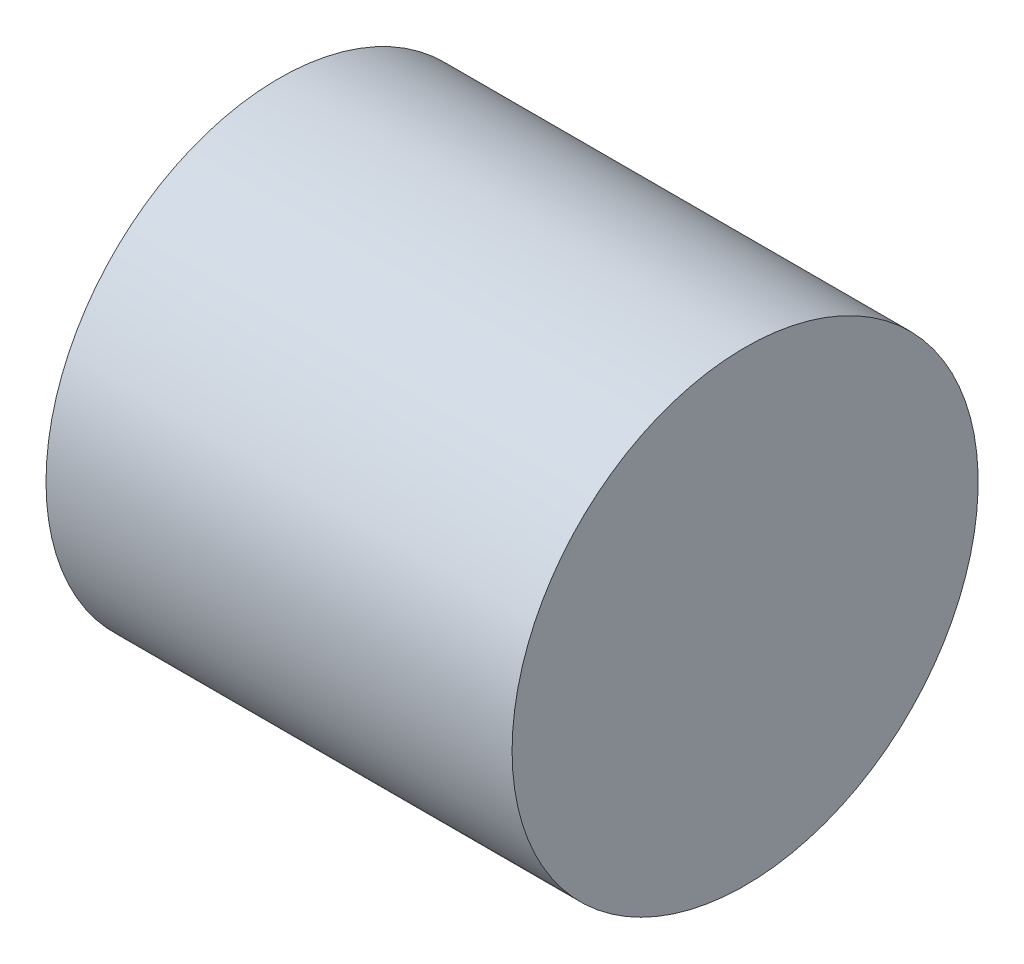
ISO-10303-21;
HEADER;
FILE_DESCRIPTION(('STEP AP214'),'2;1');
FILE_NAME('part.step','',(''),(''),'','','');
FILE_SCHEMA(('AUTOMOTIVE_DESIGN { 1 0 10303 214 1 1 1 1 }'));
ENDSEC;
DATA;
#1=APPLICATION_CONTEXT('core data for automotive mechanical design processes');
#2=APPLICATION_PROTOCOL_DEFINITION('international standard','automotive_design',2000,#1);
#3=PRODUCT_CONTEXT('',#1,'mechanical');
#4=PRODUCT('Part','Part','',(#3));
#5=PRODUCT_RELATED_PRODUCT_CATEGORY('part','',(#4));
#6=PRODUCT_DEFINITION_FORMATION('','',#4);
#7=PRODUCT_DEFINITION_CONTEXT('part definition',#1,'design');
#8=PRODUCT_DEFINITION('design','',#6,#7);
#9=PRODUCT_DEFINITION_SHAPE('','',#8);
#10=(LENGTH_UNIT() NAMED_UNIT(*) SI_UNIT(.MILLI.,.METRE.));
#11=(NAMED_UNIT(*) PLANE_ANGLE_UNIT() SI_UNIT($,.RADIAN.));
#12=(NAMED_UNIT(*) SI_UNIT($,.STERADIAN.) SOLID_ANGLE_UNIT());
#13=UNCERTAINTY_MEASURE_WITH_UNIT(LENGTH_MEASURE(1.E-05),#10,'distance_accuracy_value','');
#14=(GEOMETRIC_REPRESENTATION_CONTEXT(3) GLOBAL_UNCERTAINTY_ASSIGNED_CONTEXT((#13)) GLOBAL_UNIT_ASSIGNED_CONTEXT((#10,
#11,#12)) REPRESENTATION_CONTEXT('',''));
#15=CARTESIAN_POINT('',(0.,0.,0.));
#16=DIRECTION('',(0.,0.,1.));
#17=DIRECTION('',(1.,0.,0.));
#18=AXIS2_PLACEMENT_3D('',#15,#16,#17);
#19=CARTESIAN_POINT('',(0.,0.,0.));
#20=DIRECTION('',(1.,0.,0.));
#21=DIRECTION('',(0.,0.,-1.));
#22=AXIS2_PLACEMENT_3D('',#19,#20,#21);
#23=PLANE('',#22);
#24=CARTESIAN_POINT('',(0.,0.,0.));
#25=DIRECTION('',(-1.,0.,0.));
#26=DIRECTION('',(0.,0.,1.));
#27=AXIS2_PLACEMENT_3D('',#24,#25,#26);
#28=CIRCLE('',#27,292.1);
#29=CARTESIAN_POINT('',(0.,0.,292.1));
#30=VERTEX_POINT('',#29);
#31=EDGE_CURVE('E10',#30,#30,#28,.T.);
#32=ORIENTED_EDGE('',*,*,#31,.T.);
#33=EDGE_LOOP('',(#32));
#34=FACE_BOUND('',#33,.T.);
#35=ADVANCED_FACE('F43',(#34),#23,.F.);
#36=CARTESIAN_POINT('',(0.,0.,0.));
#37=DIRECTION('',(-1.,0.,0.));
#38=DIRECTION('',(0.,0.,1.));
#39=AXIS2_PLACEMENT_3D('',#36,#37,#38);
#40=CYLINDRICAL_SURFACE('',#39,292.1);
#41=ORIENTED_EDGE('',*,*,#31,.F.);
#42=EDGE_LOOP('',(#41));
#43=FACE_BOUND('',#42,.T.);
#44=CARTESIAN_POINT('',(584.2,0.,0.));
#45=DIRECTION('',(-1.,0.,0.));
#46=DIRECTION('',(0.,0.,1.));
#47=AXIS2_PLACEMENT_3D('',#44,#45,#46);
#48=CIRCLE('',#47,292.1);
#49=CARTESIAN_POINT('',(584.2,0.,292.1));
#50=VERTEX_POINT('',#49);
#51=EDGE_CURVE('E50',#50,#50,#48,.T.);
#52=ORIENTED_EDGE('',*,*,#51,.T.);
#53=EDGE_LOOP('',(#52));
#54=FACE_BOUND('',#53,.T.);
#55=ADVANCED_FACE('F57',(#43,#54),#40,.T.);
#56=CARTESIAN_POINT('',(584.2,292.1,0.));
#57=DIRECTION('',(-1.,0.,0.));
#58=DIRECTION('',(0.,0.,1.));
#59=AXIS2_PLACEMENT_3D('',#56,#57,#58);
#60=PLANE('',#59);
#61=ORIENTED_EDGE('',*,*,#51,.F.);
#62=EDGE_LOOP('',(#61));
#63=FACE_BOUND('',#62,.T.);
#64=ADVANCED_FACE('F59',(#63),#60,.F.);
#65=CLOSED_SHELL('',(#35,#55,#64));
#66=MANIFOLD_SOLID_BREP('B2',#65);
#67=ADVANCED_BREP_SHAPE_REPRESENTATION('',(#18,#66),#14);
#68=SHAPE_DEFINITION_REPRESENTATION(#9,#67);
ENDSEC;
END-ISO-10303-21;
